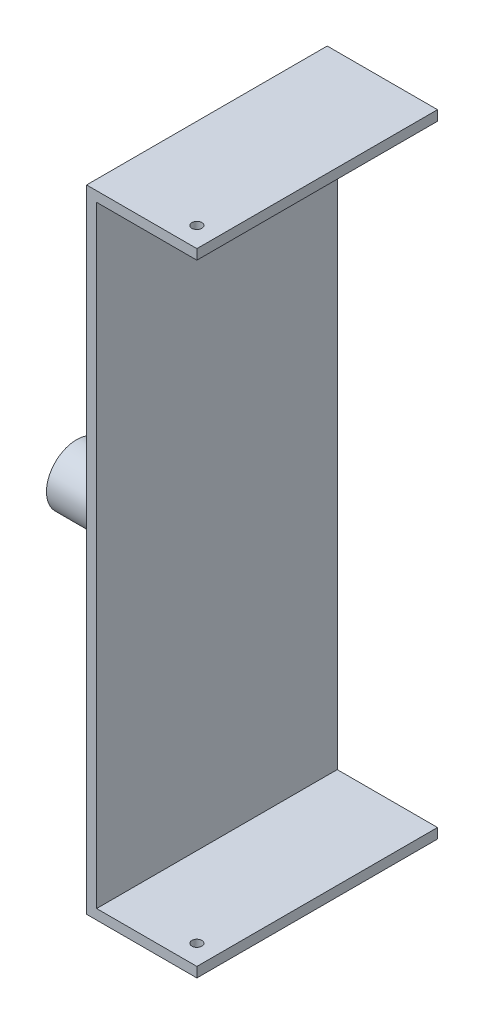
ISO-10303-21;
HEADER;
FILE_DESCRIPTION(('STEP AP214'),'2;1');
FILE_NAME('part.step','',(''),(''),'','','');
FILE_SCHEMA(('AUTOMOTIVE_DESIGN { 1 0 10303 214 1 1 1 1 }'));
ENDSEC;
DATA;
#1=APPLICATION_CONTEXT('core data for automotive mechanical design processes');
#2=APPLICATION_PROTOCOL_DEFINITION('international standard','automotive_design',2000,#1);
#3=PRODUCT_CONTEXT('',#1,'mechanical');
#4=PRODUCT('Part','Part','',(#3));
#5=PRODUCT_RELATED_PRODUCT_CATEGORY('part','',(#4));
#6=PRODUCT_DEFINITION_FORMATION('','',#4);
#7=PRODUCT_DEFINITION_CONTEXT('part definition',#1,'design');
#8=PRODUCT_DEFINITION('design','',#6,#7);
#9=PRODUCT_DEFINITION_SHAPE('','',#8);
#10=(LENGTH_UNIT() NAMED_UNIT(*) SI_UNIT(.MILLI.,.METRE.));
#11=(NAMED_UNIT(*) PLANE_ANGLE_UNIT() SI_UNIT($,.RADIAN.));
#12=(NAMED_UNIT(*) SI_UNIT($,.STERADIAN.) SOLID_ANGLE_UNIT());
#13=UNCERTAINTY_MEASURE_WITH_UNIT(LENGTH_MEASURE(1.E-05),#10,'distance_accuracy_value','');
#14=(GEOMETRIC_REPRESENTATION_CONTEXT(3) GLOBAL_UNCERTAINTY_ASSIGNED_CONTEXT((#13)) GLOBAL_UNIT_ASSIGNED_CONTEXT((#10,
#11,#12)) REPRESENTATION_CONTEXT('',''));
#15=CARTESIAN_POINT('',(0.,0.,0.));
#16=DIRECTION('',(0.,0.,1.));
#17=DIRECTION('',(1.,0.,0.));
#18=AXIS2_PLACEMENT_3D('',#15,#16,#17);
#19=CARTESIAN_POINT('',(0.,0.,120.));
#20=DIRECTION('',(-1.,0.,0.));
#21=DIRECTION('',(0.,-1.,0.));
#22=AXIS2_PLACEMENT_3D('',#19,#20,#21);
#23=PLANE('',#22);
#24=DIRECTION('',(0.,1.,0.));
#25=VECTOR('',#24,1.);
#26=CARTESIAN_POINT('',(0.,0.,0.));
#27=LINE('',#26,#25);
#28=CARTESIAN_POINT('',(0.,-305.,0.));
#29=VERTEX_POINT('',#28);
#30=CARTESIAN_POINT('',(0.,0.,0.));
#31=VERTEX_POINT('',#30);
#32=EDGE_CURVE('E142',#29,#31,#27,.T.);
#33=ORIENTED_EDGE('',*,*,#32,.T.);
#34=DIRECTION('',(0.,0.,-1.));
#35=VECTOR('',#34,1.);
#36=CARTESIAN_POINT('',(0.,0.,120.));
#37=LINE('',#36,#35);
#38=CARTESIAN_POINT('',(0.,0.,120.));
#39=VERTEX_POINT('',#38);
#40=EDGE_CURVE('E49',#39,#31,#37,.T.);
#41=ORIENTED_EDGE('',*,*,#40,.F.);
#42=DIRECTION('',(0.,1.,0.));
#43=VECTOR('',#42,1.);
#44=CARTESIAN_POINT('',(0.,0.,120.));
#45=LINE('',#44,#43);
#46=CARTESIAN_POINT('',(0.,-305.,120.));
#47=VERTEX_POINT('',#46);
#48=EDGE_CURVE('E165',#47,#39,#45,.T.);
#49=ORIENTED_EDGE('',*,*,#48,.F.);
#50=DIRECTION('',(0.,0.,-1.));
#51=VECTOR('',#50,1.);
#52=CARTESIAN_POINT('',(0.,-305.,120.));
#53=LINE('',#52,#51);
#54=EDGE_CURVE('E138',#47,#29,#53,.T.);
#55=ORIENTED_EDGE('',*,*,#54,.T.);
#56=EDGE_LOOP('',(#33,#41,#49,#55));
#57=FACE_BOUND('',#56,.T.);
#58=ADVANCED_FACE('F39',(#57),#23,.F.);
#59=CARTESIAN_POINT('',(0.,0.,120.));
#60=DIRECTION('',(0.,1.,0.));
#61=DIRECTION('',(0.,0.,1.));
#62=AXIS2_PLACEMENT_3D('',#59,#60,#61);
#63=PLANE('',#62);
#64=CARTESIAN_POINT('',(40.,0.,110.));
#65=DIRECTION('',(0.,1.,0.));
#66=DIRECTION('',(0.,0.,1.));
#67=AXIS2_PLACEMENT_3D('',#64,#65,#66);
#68=CIRCLE('',#67,2.5);
#69=CARTESIAN_POINT('',(40.,0.,112.5));
#70=VERTEX_POINT('',#69);
#71=EDGE_CURVE('E218',#70,#70,#68,.T.);
#72=ORIENTED_EDGE('',*,*,#71,.T.);
#73=EDGE_LOOP('',(#72));
#74=FACE_BOUND('',#73,.T.);
#75=DIRECTION('',(1.,0.,0.));
#76=VECTOR('',#75,1.);
#77=CARTESIAN_POINT('',(0.,0.,0.));
#78=LINE('',#77,#76);
#79=CARTESIAN_POINT('',(50.,0.,0.));
#80=VERTEX_POINT('',#79);
#81=EDGE_CURVE('E146',#31,#80,#78,.T.);
#82=ORIENTED_EDGE('',*,*,#81,.T.);
#83=DIRECTION('',(0.,0.,-1.));
#84=VECTOR('',#83,1.);
#85=CARTESIAN_POINT('',(50.,0.,120.));
#86=LINE('',#85,#84);
#87=CARTESIAN_POINT('',(50.,0.,120.));
#88=VERTEX_POINT('',#87);
#89=EDGE_CURVE('E180',#88,#80,#86,.T.);
#90=ORIENTED_EDGE('',*,*,#89,.F.);
#91=DIRECTION('',(1.,0.,0.));
#92=VECTOR('',#91,1.);
#93=CARTESIAN_POINT('',(0.,0.,120.));
#94=LINE('',#93,#92);
#95=EDGE_CURVE('E101',#39,#88,#94,.T.);
#96=ORIENTED_EDGE('',*,*,#95,.F.);
#97=ORIENTED_EDGE('',*,*,#40,.T.);
#98=EDGE_LOOP('',(#82,#90,#96,#97));
#99=FACE_BOUND('',#98,.T.);
#100=ADVANCED_FACE('F186',(#74,#99),#63,.F.);
#101=CARTESIAN_POINT('',(50.,5.,120.));
#102=DIRECTION('',(-1.,0.,0.));
#103=DIRECTION('',(0.,0.,1.));
#104=AXIS2_PLACEMENT_3D('',#101,#102,#103);
#105=PLANE('',#104);
#106=DIRECTION('',(0.,1.,0.));
#107=VECTOR('',#106,1.);
#108=CARTESIAN_POINT('',(50.,5.,0.));
#109=LINE('',#108,#107);
#110=CARTESIAN_POINT('',(50.,5.,0.));
#111=VERTEX_POINT('',#110);
#112=EDGE_CURVE('E150',#80,#111,#109,.T.);
#113=ORIENTED_EDGE('',*,*,#112,.T.);
#114=DIRECTION('',(0.,0.,-1.));
#115=VECTOR('',#114,1.);
#116=CARTESIAN_POINT('',(50.,5.,120.));
#117=LINE('',#116,#115);
#118=CARTESIAN_POINT('',(50.,5.,120.));
#119=VERTEX_POINT('',#118);
#120=EDGE_CURVE('E176',#119,#111,#117,.T.);
#121=ORIENTED_EDGE('',*,*,#120,.F.);
#122=DIRECTION('',(0.,1.,0.));
#123=VECTOR('',#122,1.);
#124=CARTESIAN_POINT('',(50.,5.,120.));
#125=LINE('',#124,#123);
#126=EDGE_CURVE('E205',#88,#119,#125,.T.);
#127=ORIENTED_EDGE('',*,*,#126,.F.);
#128=ORIENTED_EDGE('',*,*,#89,.T.);
#129=EDGE_LOOP('',(#113,#121,#127,#128));
#130=FACE_BOUND('',#129,.T.);
#131=ADVANCED_FACE('F197',(#130),#105,.F.);
#132=CARTESIAN_POINT('',(-5.,5.,120.));
#133=DIRECTION('',(0.,-1.,0.));
#134=DIRECTION('',(0.,0.,-1.));
#135=AXIS2_PLACEMENT_3D('',#132,#133,#134);
#136=PLANE('',#135);
#137=CARTESIAN_POINT('',(40.,5.,110.));
#138=DIRECTION('',(0.,-1.,0.));
#139=DIRECTION('',(0.,0.,-1.));
#140=AXIS2_PLACEMENT_3D('',#137,#138,#139);
#141=CIRCLE('',#140,2.5);
#142=CARTESIAN_POINT('',(40.,5.,107.5));
#143=VERTEX_POINT('',#142);
#144=EDGE_CURVE('E222',#143,#143,#141,.T.);
#145=ORIENTED_EDGE('',*,*,#144,.T.);
#146=EDGE_LOOP('',(#145));
#147=FACE_BOUND('',#146,.T.);
#148=DIRECTION('',(-1.,0.,0.));
#149=VECTOR('',#148,1.);
#150=CARTESIAN_POINT('',(-5.,5.,0.));
#151=LINE('',#150,#149);
#152=CARTESIAN_POINT('',(-5.,5.,0.));
#153=VERTEX_POINT('',#152);
#154=EDGE_CURVE('E153',#111,#153,#151,.T.);
#155=ORIENTED_EDGE('',*,*,#154,.T.);
#156=DIRECTION('',(0.,0.,-1.));
#157=VECTOR('',#156,1.);
#158=CARTESIAN_POINT('',(-5.,5.,120.));
#159=LINE('',#158,#157);
#160=CARTESIAN_POINT('',(-5.,5.,120.));
#161=VERTEX_POINT('',#160);
#162=EDGE_CURVE('E172',#161,#153,#159,.T.);
#163=ORIENTED_EDGE('',*,*,#162,.F.);
#164=DIRECTION('',(-1.,0.,0.));
#165=VECTOR('',#164,1.);
#166=CARTESIAN_POINT('',(-5.,5.,120.));
#167=LINE('',#166,#165);
#168=EDGE_CURVE('E203',#119,#161,#167,.T.);
#169=ORIENTED_EDGE('',*,*,#168,.F.);
#170=ORIENTED_EDGE('',*,*,#120,.T.);
#171=EDGE_LOOP('',(#155,#163,#169,#170));
#172=FACE_BOUND('',#171,.T.);
#173=ADVANCED_FACE('F201',(#147,#172),#136,.F.);
#174=CARTESIAN_POINT('',(-5.,5.,120.));
#175=DIRECTION('',(1.,0.,0.));
#176=DIRECTION('',(0.,1.,0.));
#177=AXIS2_PLACEMENT_3D('',#174,#175,#176);
#178=PLANE('',#177);
#179=CARTESIAN_POINT('',(-4.99999999999998,-152.5,90.));
#180=DIRECTION('',(1.,0.,0.));
#181=DIRECTION('',(0.,1.,0.));
#182=AXIS2_PLACEMENT_3D('',#179,#180,#181);
#183=CIRCLE('',#182,15.);
#184=CARTESIAN_POINT('',(-4.99999999999998,-137.5,90.));
#185=VERTEX_POINT('',#184);
#186=EDGE_CURVE('E11',#185,#185,#183,.F.);
#187=ORIENTED_EDGE('',*,*,#186,.F.);
#188=EDGE_LOOP('',(#187));
#189=FACE_BOUND('',#188,.T.);
#190=DIRECTION('',(0.,-1.,0.));
#191=VECTOR('',#190,1.);
#192=CARTESIAN_POINT('',(-5.,5.,0.));
#193=LINE('',#192,#191);
#194=CARTESIAN_POINT('',(-4.99999999999996,-310.,0.));
#195=VERTEX_POINT('',#194);
#196=EDGE_CURVE('E156',#153,#195,#193,.T.);
#197=ORIENTED_EDGE('',*,*,#196,.T.);
#198=DIRECTION('',(0.,0.,-1.));
#199=VECTOR('',#198,1.);
#200=CARTESIAN_POINT('',(-4.99999999999996,-310.,120.));
#201=LINE('',#200,#199);
#202=CARTESIAN_POINT('',(-4.99999999999996,-310.,120.));
#203=VERTEX_POINT('',#202);
#204=EDGE_CURVE('E131',#203,#195,#201,.T.);
#205=ORIENTED_EDGE('',*,*,#204,.F.);
#206=DIRECTION('',(0.,-1.,0.));
#207=VECTOR('',#206,1.);
#208=CARTESIAN_POINT('',(-5.,5.,120.));
#209=LINE('',#208,#207);
#210=EDGE_CURVE('E120',#161,#203,#209,.T.);
#211=ORIENTED_EDGE('',*,*,#210,.F.);
#212=ORIENTED_EDGE('',*,*,#162,.T.);
#213=EDGE_LOOP('',(#197,#205,#211,#212));
#214=FACE_BOUND('',#213,.T.);
#215=ADVANCED_FACE('F262',(#189,#214),#178,.F.);
#216=CARTESIAN_POINT('',(-4.99999999999996,-310.,120.));
#217=DIRECTION('',(0.,1.,0.));
#218=DIRECTION('',(0.,0.,1.));
#219=AXIS2_PLACEMENT_3D('',#216,#217,#218);
#220=PLANE('',#219);
#221=CARTESIAN_POINT('',(40.,-310.,110.));
#222=DIRECTION('',(0.,-1.,0.));
#223=DIRECTION('',(0.,0.,-1.));
#224=AXIS2_PLACEMENT_3D('',#221,#222,#223);
#225=CIRCLE('',#224,2.5);
#226=CARTESIAN_POINT('',(40.,-310.,107.5));
#227=VERTEX_POINT('',#226);
#228=EDGE_CURVE('E226',#227,#227,#225,.T.);
#229=ORIENTED_EDGE('',*,*,#228,.F.);
#230=EDGE_LOOP('',(#229));
#231=FACE_BOUND('',#230,.T.);
#232=DIRECTION('',(1.,0.,0.));
#233=VECTOR('',#232,1.);
#234=CARTESIAN_POINT('',(-4.99999999999996,-310.,0.));
#235=LINE('',#234,#233);
#236=CARTESIAN_POINT('',(50.,-310.,0.));
#237=VERTEX_POINT('',#236);
#238=EDGE_CURVE('E129',#195,#237,#235,.T.);
#239=ORIENTED_EDGE('',*,*,#238,.T.);
#240=DIRECTION('',(0.,0.,-1.));
#241=VECTOR('',#240,1.);
#242=CARTESIAN_POINT('',(50.,-310.,120.));
#243=LINE('',#242,#241);
#244=CARTESIAN_POINT('',(50.,-310.,120.));
#245=VERTEX_POINT('',#244);
#246=EDGE_CURVE('E126',#245,#237,#243,.T.);
#247=ORIENTED_EDGE('',*,*,#246,.F.);
#248=DIRECTION('',(1.,0.,0.));
#249=VECTOR('',#248,1.);
#250=CARTESIAN_POINT('',(-4.99999999999996,-310.,120.));
#251=LINE('',#250,#249);
#252=EDGE_CURVE('E114',#203,#245,#251,.T.);
#253=ORIENTED_EDGE('',*,*,#252,.F.);
#254=ORIENTED_EDGE('',*,*,#204,.T.);
#255=EDGE_LOOP('',(#239,#247,#253,#254));
#256=FACE_BOUND('',#255,.T.);
#257=ADVANCED_FACE('F127',(#231,#256),#220,.F.);
#258=CARTESIAN_POINT('',(50.,-305.,120.));
#259=DIRECTION('',(-1.,0.,0.));
#260=DIRECTION('',(0.,0.,1.));
#261=AXIS2_PLACEMENT_3D('',#258,#259,#260);
#262=PLANE('',#261);
#263=DIRECTION('',(0.,1.,0.));
#264=VECTOR('',#263,1.);
#265=CARTESIAN_POINT('',(50.,-305.,0.));
#266=LINE('',#265,#264);
#267=CARTESIAN_POINT('',(50.,-305.,0.));
#268=VERTEX_POINT('',#267);
#269=EDGE_CURVE('E86',#237,#268,#266,.T.);
#270=ORIENTED_EDGE('',*,*,#269,.T.);
#271=DIRECTION('',(0.,0.,-1.));
#272=VECTOR('',#271,1.);
#273=CARTESIAN_POINT('',(50.,-305.,120.));
#274=LINE('',#273,#272);
#275=CARTESIAN_POINT('',(50.,-305.,120.));
#276=VERTEX_POINT('',#275);
#277=EDGE_CURVE('E132',#276,#268,#274,.T.);
#278=ORIENTED_EDGE('',*,*,#277,.F.);
#279=DIRECTION('',(0.,1.,0.));
#280=VECTOR('',#279,1.);
#281=CARTESIAN_POINT('',(50.,-305.,120.));
#282=LINE('',#281,#280);
#283=EDGE_CURVE('E118',#245,#276,#282,.T.);
#284=ORIENTED_EDGE('',*,*,#283,.F.);
#285=ORIENTED_EDGE('',*,*,#246,.T.);
#286=EDGE_LOOP('',(#270,#278,#284,#285));
#287=FACE_BOUND('',#286,.T.);
#288=ADVANCED_FACE('F134',(#287),#262,.F.);
#289=CARTESIAN_POINT('',(0.,-305.,120.));
#290=DIRECTION('',(0.,-1.,0.));
#291=DIRECTION('',(0.,0.,-1.));
#292=AXIS2_PLACEMENT_3D('',#289,#290,#291);
#293=PLANE('',#292);
#294=CARTESIAN_POINT('',(40.,-305.,110.));
#295=DIRECTION('',(0.,-1.,0.));
#296=DIRECTION('',(0.,0.,-1.));
#297=AXIS2_PLACEMENT_3D('',#294,#295,#296);
#298=CIRCLE('',#297,2.5);
#299=CARTESIAN_POINT('',(40.,-305.,107.5));
#300=VERTEX_POINT('',#299);
#301=EDGE_CURVE('E42',#300,#300,#298,.T.);
#302=ORIENTED_EDGE('',*,*,#301,.T.);
#303=EDGE_LOOP('',(#302));
#304=FACE_BOUND('',#303,.T.);
#305=DIRECTION('',(-1.,0.,0.));
#306=VECTOR('',#305,1.);
#307=CARTESIAN_POINT('',(0.,-305.,0.));
#308=LINE('',#307,#306);
#309=EDGE_CURVE('E92',#268,#29,#308,.T.);
#310=ORIENTED_EDGE('',*,*,#309,.T.);
#311=ORIENTED_EDGE('',*,*,#54,.F.);
#312=DIRECTION('',(-1.,0.,0.));
#313=VECTOR('',#312,1.);
#314=CARTESIAN_POINT('',(0.,-305.,120.));
#315=LINE('',#314,#313);
#316=EDGE_CURVE('E57',#276,#47,#315,.T.);
#317=ORIENTED_EDGE('',*,*,#316,.F.);
#318=ORIENTED_EDGE('',*,*,#277,.T.);
#319=EDGE_LOOP('',(#310,#311,#317,#318));
#320=FACE_BOUND('',#319,.T.);
#321=ADVANCED_FACE('F235',(#304,#320),#293,.F.);
#322=CARTESIAN_POINT('',(0.,0.,120.));
#323=DIRECTION('',(0.,0.,1.));
#324=DIRECTION('',(1.,0.,0.));
#325=AXIS2_PLACEMENT_3D('',#322,#323,#324);
#326=PLANE('',#325);
#327=ORIENTED_EDGE('',*,*,#48,.T.);
#328=ORIENTED_EDGE('',*,*,#95,.T.);
#329=ORIENTED_EDGE('',*,*,#126,.T.);
#330=ORIENTED_EDGE('',*,*,#168,.T.);
#331=ORIENTED_EDGE('',*,*,#210,.T.);
#332=ORIENTED_EDGE('',*,*,#252,.T.);
#333=ORIENTED_EDGE('',*,*,#283,.T.);
#334=ORIENTED_EDGE('',*,*,#316,.T.);
#335=EDGE_LOOP('',(#327,#328,#329,#330,#331,#332,#333,#334));
#336=FACE_BOUND('',#335,.T.);
#337=ADVANCED_FACE('F116',(#336),#326,.T.);
#338=CARTESIAN_POINT('',(0.,0.,0.));
#339=DIRECTION('',(0.,0.,1.));
#340=DIRECTION('',(1.,0.,0.));
#341=AXIS2_PLACEMENT_3D('',#338,#339,#340);
#342=PLANE('',#341);
#343=ORIENTED_EDGE('',*,*,#32,.F.);
#344=ORIENTED_EDGE('',*,*,#309,.F.);
#345=ORIENTED_EDGE('',*,*,#269,.F.);
#346=ORIENTED_EDGE('',*,*,#238,.F.);
#347=ORIENTED_EDGE('',*,*,#196,.F.);
#348=ORIENTED_EDGE('',*,*,#154,.F.);
#349=ORIENTED_EDGE('',*,*,#112,.F.);
#350=ORIENTED_EDGE('',*,*,#81,.F.);
#351=EDGE_LOOP('',(#343,#344,#345,#346,#347,#348,#349,#350));
#352=FACE_BOUND('',#351,.T.);
#353=ADVANCED_FACE('F191',(#352),#342,.F.);
#354=CARTESIAN_POINT('',(-40.,-152.5,90.));
#355=DIRECTION('',(1.,0.,0.));
#356=DIRECTION('',(0.,0.,-1.));
#357=AXIS2_PLACEMENT_3D('',#354,#355,#356);
#358=CYLINDRICAL_SURFACE('',#357,15.);
#359=CARTESIAN_POINT('',(-40.,-152.5,90.));
#360=DIRECTION('',(-1.,0.,0.));
#361=DIRECTION('',(0.,0.,1.));
#362=AXIS2_PLACEMENT_3D('',#359,#360,#361);
#363=CIRCLE('',#362,15.);
#364=CARTESIAN_POINT('',(-40.,-152.5,105.));
#365=VERTEX_POINT('',#364);
#366=EDGE_CURVE('E147',#365,#365,#363,.T.);
#367=ORIENTED_EDGE('',*,*,#366,.F.);
#368=EDGE_LOOP('',(#367));
#369=FACE_BOUND('',#368,.T.);
#370=ORIENTED_EDGE('',*,*,#186,.T.);
#371=EDGE_LOOP('',(#370));
#372=FACE_BOUND('',#371,.T.);
#373=ADVANCED_FACE('F247',(#369,#372),#358,.T.);
#374=CARTESIAN_POINT('',(-40.,-152.5,90.));
#375=DIRECTION('',(-1.,0.,0.));
#376=DIRECTION('',(0.,0.,1.));
#377=AXIS2_PLACEMENT_3D('',#374,#375,#376);
#378=PLANE('',#377);
#379=ORIENTED_EDGE('',*,*,#366,.T.);
#380=EDGE_LOOP('',(#379));
#381=FACE_BOUND('',#380,.T.);
#382=ADVANCED_FACE('F240',(#381),#378,.T.);
#383=CARTESIAN_POINT('',(40.,10.,110.));
#384=DIRECTION('',(0.,-1.,0.));
#385=DIRECTION('',(0.,0.,-1.));
#386=AXIS2_PLACEMENT_3D('',#383,#384,#385);
#387=CYLINDRICAL_SURFACE('',#386,2.5);
#388=ORIENTED_EDGE('',*,*,#228,.T.);
#389=EDGE_LOOP('',(#388));
#390=FACE_BOUND('',#389,.T.);
#391=ORIENTED_EDGE('',*,*,#301,.F.);
#392=EDGE_LOOP('',(#391));
#393=FACE_BOUND('',#392,.T.);
#394=ADVANCED_FACE('F237',(#390,#393),#387,.F.);
#395=ORIENTED_EDGE('',*,*,#144,.F.);
#396=EDGE_LOOP('',(#395));
#397=FACE_BOUND('',#396,.T.);
#398=ORIENTED_EDGE('',*,*,#71,.F.);
#399=EDGE_LOOP('',(#398));
#400=FACE_BOUND('',#399,.T.);
#401=ADVANCED_FACE('F239',(#397,#400),#387,.F.);
#402=CLOSED_SHELL('',(#58,#100,#131,#173,#215,#257,#288,#321,#337,#353,#373,#382,#394,#401));
#403=MANIFOLD_SOLID_BREP('B2',#402);
#404=ADVANCED_BREP_SHAPE_REPRESENTATION('',(#18,#403),#14);
#405=SHAPE_DEFINITION_REPRESENTATION(#9,#404);
ENDSEC;
END-ISO-10303-21;
